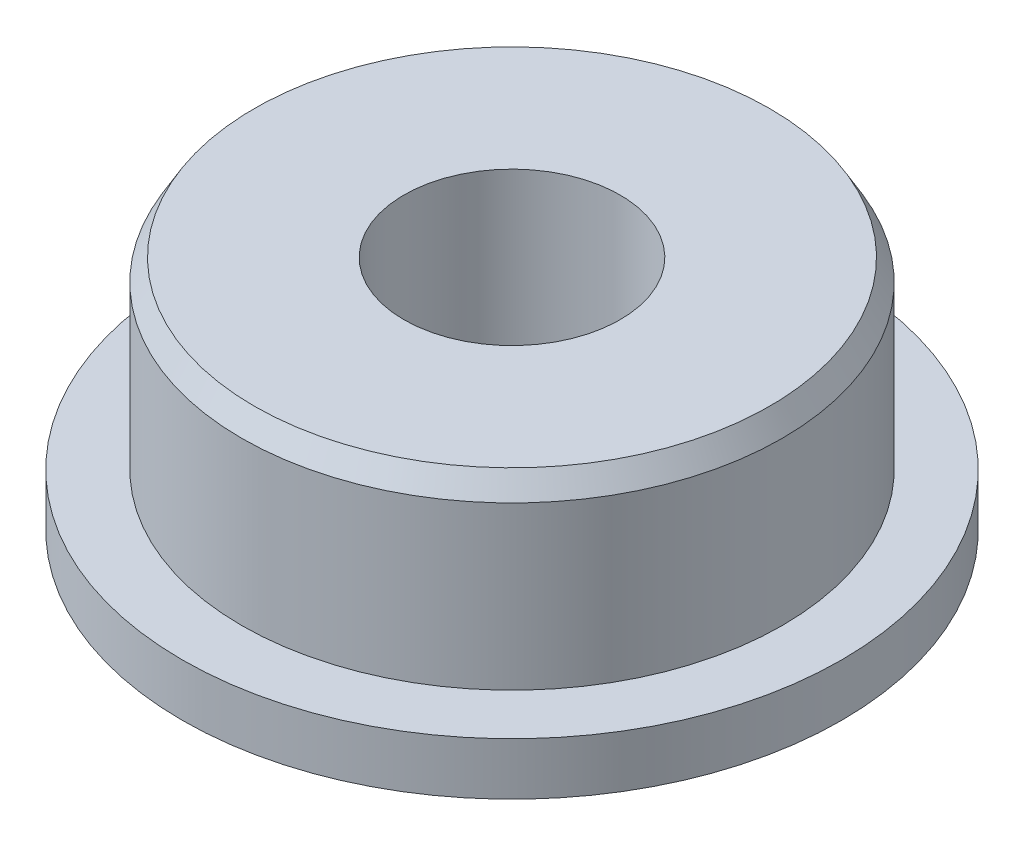
ISO-10303-21;
HEADER;
FILE_DESCRIPTION(('STEP AP214'),'2;1');
FILE_NAME('part.step','',(''),(''),'','','');
FILE_SCHEMA(('AUTOMOTIVE_DESIGN { 1 0 10303 214 1 1 1 1 }'));
ENDSEC;
DATA;
#1=APPLICATION_CONTEXT('core data for automotive mechanical design processes');
#2=APPLICATION_PROTOCOL_DEFINITION('international standard','automotive_design',2000,#1);
#3=PRODUCT_CONTEXT('',#1,'mechanical');
#4=PRODUCT('Part','Part','',(#3));
#5=PRODUCT_RELATED_PRODUCT_CATEGORY('part','',(#4));
#6=PRODUCT_DEFINITION_FORMATION('','',#4);
#7=PRODUCT_DEFINITION_CONTEXT('part definition',#1,'design');
#8=PRODUCT_DEFINITION('design','',#6,#7);
#9=PRODUCT_DEFINITION_SHAPE('','',#8);
#10=(LENGTH_UNIT() NAMED_UNIT(*) SI_UNIT(.MILLI.,.METRE.));
#11=(NAMED_UNIT(*) PLANE_ANGLE_UNIT() SI_UNIT($,.RADIAN.));
#12=(NAMED_UNIT(*) SI_UNIT($,.STERADIAN.) SOLID_ANGLE_UNIT());
#13=UNCERTAINTY_MEASURE_WITH_UNIT(LENGTH_MEASURE(1.E-05),#10,'distance_accuracy_value','');
#14=(GEOMETRIC_REPRESENTATION_CONTEXT(3) GLOBAL_UNCERTAINTY_ASSIGNED_CONTEXT((#13)) GLOBAL_UNIT_ASSIGNED_CONTEXT((#10,
#11,#12)) REPRESENTATION_CONTEXT('',''));
#15=CARTESIAN_POINT('',(0.,0.,0.));
#16=DIRECTION('',(0.,0.,1.));
#17=DIRECTION('',(1.,0.,0.));
#18=AXIS2_PLACEMENT_3D('',#15,#16,#17);
#19=CARTESIAN_POINT('',(0.,2.3,0.));
#20=DIRECTION('',(0.,-1.,0.));
#21=DIRECTION('',(0.,0.,-1.));
#22=AXIS2_PLACEMENT_3D('',#19,#20,#21);
#23=CYLINDRICAL_SURFACE('',#22,0.999999999999999);
#24=CARTESIAN_POINT('',(0.,2.3,0.));
#25=DIRECTION('',(0.,1.,0.));
#26=DIRECTION('',(0.,0.,1.));
#27=AXIS2_PLACEMENT_3D('',#24,#25,#26);
#28=CIRCLE('',#27,0.999999999999999);
#29=CARTESIAN_POINT('',(0.,2.3,0.999999999999999));
#30=VERTEX_POINT('',#29);
#31=EDGE_CURVE('E56',#30,#30,#28,.T.);
#32=ORIENTED_EDGE('',*,*,#31,.T.);
#33=EDGE_LOOP('',(#32));
#34=FACE_BOUND('',#33,.T.);
#35=CARTESIAN_POINT('',(0.,0.,0.));
#36=DIRECTION('',(0.,1.,0.));
#37=DIRECTION('',(0.,0.,1.));
#38=AXIS2_PLACEMENT_3D('',#35,#36,#37);
#39=CIRCLE('',#38,0.999999999999999);
#40=CARTESIAN_POINT('',(0.,0.,0.999999999999999));
#41=VERTEX_POINT('',#40);
#42=EDGE_CURVE('E57',#41,#41,#39,.T.);
#43=ORIENTED_EDGE('',*,*,#42,.F.);
#44=EDGE_LOOP('',(#43));
#45=FACE_BOUND('',#44,.T.);
#46=ADVANCED_FACE('F36',(#34,#45),#23,.F.);
#47=CARTESIAN_POINT('',(0.,2.3,0.));
#48=DIRECTION('',(0.,-1.,0.));
#49=DIRECTION('',(0.,0.,-1.));
#50=AXIS2_PLACEMENT_3D('',#47,#48,#49);
#51=CYLINDRICAL_SURFACE('',#50,2.5);
#52=CARTESIAN_POINT('',(0.,2.1,0.));
#53=DIRECTION('',(0.,1.,0.));
#54=DIRECTION('',(0.,0.,1.));
#55=AXIS2_PLACEMENT_3D('',#52,#53,#54);
#56=CIRCLE('',#55,2.5);
#57=CARTESIAN_POINT('',(0.,2.09999999999999,-2.5));
#58=VERTEX_POINT('',#57);
#59=EDGE_CURVE('E10',#58,#58,#56,.F.);
#60=ORIENTED_EDGE('',*,*,#59,.T.);
#61=EDGE_LOOP('',(#60));
#62=FACE_BOUND('',#61,.T.);
#63=CARTESIAN_POINT('',(0.,0.6,0.));
#64=DIRECTION('',(0.,1.,0.));
#65=DIRECTION('',(0.,0.,1.));
#66=AXIS2_PLACEMENT_3D('',#63,#64,#65);
#67=CIRCLE('',#66,2.5);
#68=CARTESIAN_POINT('',(0.,0.6,2.5));
#69=VERTEX_POINT('',#68);
#70=EDGE_CURVE('E65',#69,#69,#67,.T.);
#71=ORIENTED_EDGE('',*,*,#70,.T.);
#72=EDGE_LOOP('',(#71));
#73=FACE_BOUND('',#72,.T.);
#74=ADVANCED_FACE('F69',(#62,#73),#51,.T.);
#75=CARTESIAN_POINT('',(0.,2.3,0.));
#76=DIRECTION('',(0.,1.,0.));
#77=DIRECTION('',(0.,0.,1.));
#78=AXIS2_PLACEMENT_3D('',#75,#76,#77);
#79=PLANE('',#78);
#80=CARTESIAN_POINT('',(0.,2.3,0.));
#81=DIRECTION('',(0.,1.,0.));
#82=DIRECTION('',(0.,0.,1.));
#83=AXIS2_PLACEMENT_3D('',#80,#81,#82);
#84=CIRCLE('',#83,2.38452994616207);
#85=CARTESIAN_POINT('',(0.,2.3,-2.38452994616207));
#86=VERTEX_POINT('',#85);
#87=EDGE_CURVE('E43',#86,#86,#84,.T.);
#88=ORIENTED_EDGE('',*,*,#87,.T.);
#89=EDGE_LOOP('',(#88));
#90=FACE_BOUND('',#89,.T.);
#91=ORIENTED_EDGE('',*,*,#31,.F.);
#92=EDGE_LOOP('',(#91));
#93=FACE_BOUND('',#92,.T.);
#94=ADVANCED_FACE('F86',(#90,#93),#79,.T.);
#95=CARTESIAN_POINT('',(0.,0.,0.));
#96=DIRECTION('',(0.,1.,0.));
#97=DIRECTION('',(0.,0.,1.));
#98=AXIS2_PLACEMENT_3D('',#95,#96,#97);
#99=PLANE('',#98);
#100=CARTESIAN_POINT('',(0.,0.,0.));
#101=DIRECTION('',(0.,1.,0.));
#102=DIRECTION('',(0.,0.,1.));
#103=AXIS2_PLACEMENT_3D('',#100,#101,#102);
#104=CIRCLE('',#103,2.85);
#105=CARTESIAN_POINT('',(0.,0.,2.85));
#106=VERTEX_POINT('',#105);
#107=EDGE_CURVE('E47',#106,#106,#104,.F.);
#108=ORIENTED_EDGE('',*,*,#107,.T.);
#109=EDGE_LOOP('',(#108));
#110=FACE_BOUND('',#109,.T.);
#111=ORIENTED_EDGE('',*,*,#42,.T.);
#112=EDGE_LOOP('',(#111));
#113=FACE_BOUND('',#112,.T.);
#114=ADVANCED_FACE('F80',(#110,#113),#99,.F.);
#115=CARTESIAN_POINT('',(0.,0.6,0.));
#116=DIRECTION('',(0.,-1.,0.));
#117=DIRECTION('',(0.,0.,-1.));
#118=AXIS2_PLACEMENT_3D('',#115,#116,#117);
#119=CYLINDRICAL_SURFACE('',#118,3.05);
#120=CARTESIAN_POINT('',(0.,0.115470053837926,0.));
#121=DIRECTION('',(0.,1.,0.));
#122=DIRECTION('',(0.,0.,1.));
#123=AXIS2_PLACEMENT_3D('',#120,#121,#122);
#124=CIRCLE('',#123,3.05);
#125=CARTESIAN_POINT('',(0.,0.115470053837926,3.05));
#126=VERTEX_POINT('',#125);
#127=EDGE_CURVE('E51',#126,#126,#124,.T.);
#128=ORIENTED_EDGE('',*,*,#127,.T.);
#129=EDGE_LOOP('',(#128));
#130=FACE_BOUND('',#129,.T.);
#131=CARTESIAN_POINT('',(0.,0.6,0.));
#132=DIRECTION('',(0.,1.,0.));
#133=DIRECTION('',(0.,0.,1.));
#134=AXIS2_PLACEMENT_3D('',#131,#132,#133);
#135=CIRCLE('',#134,3.05);
#136=CARTESIAN_POINT('',(0.,0.6,3.05));
#137=VERTEX_POINT('',#136);
#138=EDGE_CURVE('E60',#137,#137,#135,.T.);
#139=ORIENTED_EDGE('',*,*,#138,.F.);
#140=EDGE_LOOP('',(#139));
#141=FACE_BOUND('',#140,.T.);
#142=ADVANCED_FACE('F75',(#130,#141),#119,.T.);
#143=CARTESIAN_POINT('',(0.,0.6,0.));
#144=DIRECTION('',(0.,1.,0.));
#145=DIRECTION('',(0.,0.,1.));
#146=AXIS2_PLACEMENT_3D('',#143,#144,#145);
#147=PLANE('',#146);
#148=ORIENTED_EDGE('',*,*,#70,.F.);
#149=EDGE_LOOP('',(#148));
#150=FACE_BOUND('',#149,.T.);
#151=ORIENTED_EDGE('',*,*,#138,.T.);
#152=EDGE_LOOP('',(#151));
#153=FACE_BOUND('',#152,.T.);
#154=ADVANCED_FACE('F71',(#150,#153),#147,.T.);
#155=CARTESIAN_POINT('',(0.,0.115470053837926,0.));
#156=DIRECTION('',(0.,1.,0.));
#157=DIRECTION('',(0.,0.,1.));
#158=AXIS2_PLACEMENT_3D('',#155,#156,#157);
#159=CONICAL_SURFACE('',#158,3.05,1.0471975511966);
#160=ORIENTED_EDGE('',*,*,#107,.F.);
#161=EDGE_LOOP('',(#160));
#162=FACE_BOUND('',#161,.T.);
#163=ORIENTED_EDGE('',*,*,#127,.F.);
#164=EDGE_LOOP('',(#163));
#165=FACE_BOUND('',#164,.T.);
#166=ADVANCED_FACE('F74',(#162,#165),#159,.T.);
#167=CARTESIAN_POINT('',(0.,2.3,0.));
#168=DIRECTION('',(0.,-1.,0.));
#169=DIRECTION('',(0.,0.,-1.));
#170=AXIS2_PLACEMENT_3D('',#167,#168,#169);
#171=CONICAL_SURFACE('',#170,2.38452994616207,0.523598775598299);
#172=CARTESIAN_POINT('',(0.,2.09999999999999,-2.5));
#173=CARTESIAN_POINT('',(0.,2.10208333333333,-2.49879718693919));
#174=CARTESIAN_POINT('',(0.,2.10416666666666,-2.49759437387838));
#175=CARTESIAN_POINT('',(0.,2.10833333333333,-2.49518874775675));
#176=CARTESIAN_POINT('',(0.,2.11041666666666,-2.49398593469594));
#177=CARTESIAN_POINT('',(0.,2.11458333333333,-2.49158030857432));
#178=CARTESIAN_POINT('',(0.,2.11666666666666,-2.49037749551351));
#179=CARTESIAN_POINT('',(0.,2.12083333333333,-2.48797186939188));
#180=CARTESIAN_POINT('',(0.,2.12291666666666,-2.48676905633107));
#181=CARTESIAN_POINT('',(0.,2.12708333333333,-2.48436343020945));
#182=CARTESIAN_POINT('',(0.,2.12916666666666,-2.48316061714864));
#183=CARTESIAN_POINT('',(0.,2.13333333333333,-2.48075499102701));
#184=CARTESIAN_POINT('',(0.,2.13541666666666,-2.4795521779662));
#185=CARTESIAN_POINT('',(0.,2.13958333333333,-2.47714655184458));
#186=CARTESIAN_POINT('',(0.,2.14166666666666,-2.47594373878377));
#187=CARTESIAN_POINT('',(0.,2.14583333333333,-2.47353811266214));
#188=CARTESIAN_POINT('',(0.,2.14791666666666,-2.47233529960133));
#189=CARTESIAN_POINT('',(0.,2.15208333333333,-2.46992967347971));
#190=CARTESIAN_POINT('',(0.,2.15416666666666,-2.46872686041889));
#191=CARTESIAN_POINT('',(0.,2.15833333333333,-2.46632123429727));
#192=CARTESIAN_POINT('',(0.,2.16041666666666,-2.46511842123646));
#193=CARTESIAN_POINT('',(0.,2.16458333333333,-2.46271279511484));
#194=CARTESIAN_POINT('',(0.,2.16666666666666,-2.46150998205402));
#195=CARTESIAN_POINT('',(0.,2.17083333333333,-2.4591043559324));
#196=CARTESIAN_POINT('',(0.,2.17291666666666,-2.45790154287159));
#197=CARTESIAN_POINT('',(0.,2.17708333333333,-2.45549591674997));
#198=CARTESIAN_POINT('',(0.,2.17916666666666,-2.45429310368915));
#199=CARTESIAN_POINT('',(0.,2.18333333333333,-2.45188747756753));
#200=CARTESIAN_POINT('',(0.,2.18541666666666,-2.45068466450672));
#201=CARTESIAN_POINT('',(0.,2.18958333333333,-2.44827903838509));
#202=CARTESIAN_POINT('',(0.,2.19166666666666,-2.44707622532428));
#203=CARTESIAN_POINT('',(0.,2.19583333333333,-2.44467059920266));
#204=CARTESIAN_POINT('',(0.,2.19791666666666,-2.44346778614185));
#205=CARTESIAN_POINT('',(0.,2.20208333333333,-2.44106216002022));
#206=CARTESIAN_POINT('',(0.,2.20416666666666,-2.43985934695941));
#207=CARTESIAN_POINT('',(0.,2.20833333333333,-2.43745372083779));
#208=CARTESIAN_POINT('',(0.,2.21041666666666,-2.43625090777698));
#209=CARTESIAN_POINT('',(0.,2.21458333333333,-2.43384528165535));
#210=CARTESIAN_POINT('',(0.,2.21666666666666,-2.43264246859454));
#211=CARTESIAN_POINT('',(0.,2.22083333333333,-2.43023684247292));
#212=CARTESIAN_POINT('',(0.,2.22291666666666,-2.42903402941211));
#213=CARTESIAN_POINT('',(0.,2.22708333333333,-2.42662840329048));
#214=CARTESIAN_POINT('',(0.,2.22916666666666,-2.42542559022967));
#215=CARTESIAN_POINT('',(0.,2.23333333333333,-2.42301996410805));
#216=CARTESIAN_POINT('',(0.,2.23541666666666,-2.42181715104724));
#217=CARTESIAN_POINT('',(0.,2.23958333333333,-2.41941152492561));
#218=CARTESIAN_POINT('',(0.,2.24166666666666,-2.4182087118648));
#219=CARTESIAN_POINT('',(0.,2.24583333333333,-2.41580308574318));
#220=CARTESIAN_POINT('',(0.,2.24791666666667,-2.41460027268237));
#221=CARTESIAN_POINT('',(0.,2.25208333333333,-2.41219464656074));
#222=CARTESIAN_POINT('',(0.,2.25416666666667,-2.41099183349993));
#223=CARTESIAN_POINT('',(0.,2.25833333333333,-2.40858620737831));
#224=CARTESIAN_POINT('',(0.,2.26041666666667,-2.4073833943175));
#225=CARTESIAN_POINT('',(0.,2.26458333333333,-2.40497776819587));
#226=CARTESIAN_POINT('',(0.,2.26666666666667,-2.40377495513506));
#227=CARTESIAN_POINT('',(0.,2.27083333333333,-2.40136932901344));
#228=CARTESIAN_POINT('',(0.,2.27291666666667,-2.40016651595263));
#229=CARTESIAN_POINT('',(0.,2.27708333333333,-2.397760889831));
#230=CARTESIAN_POINT('',(0.,2.27916666666667,-2.39655807677019));
#231=CARTESIAN_POINT('',(0.,2.28333333333333,-2.39415245064857));
#232=CARTESIAN_POINT('',(0.,2.28541666666667,-2.39294963758775));
#233=CARTESIAN_POINT('',(0.,2.28958333333333,-2.39054401146613));
#234=CARTESIAN_POINT('',(0.,2.29166666666667,-2.38934119840532));
#235=CARTESIAN_POINT('',(0.,2.29583333333333,-2.3869355722837));
#236=CARTESIAN_POINT('',(0.,2.29791666666667,-2.38573275922288));
#237=CARTESIAN_POINT('',(0.,2.3,-2.38452994616207));
#238=B_SPLINE_CURVE_WITH_KNOTS('',3,(#172,#173,#174,#175,#176,#177,#178,#179,#180,#181,#182,
#183,#184,#185,#186,#187,#188,#189,#190,#191,#192,#193,#194,#195,#196,#197,#198,#199,#200,#201,
#202,#203,#204,#205,#206,#207,#208,#209,#210,#211,#212,#213,#214,#215,#216,#217,#218,#219,#220,
#221,#222,#223,#224,#225,#226,#227,#228,#229,#230,#231,#232,#233,#234,#235,#236,#237),
.UNSPECIFIED.,.F.,.F.,(4,2,2,2,2,2,2,2,2,2,2,2,2,2,2,2,2,2,2,2,2,2,2,2,2,2,2,2,2,2,2,2,4),(0.,
0.0072168783648705,0.014433756729741,0.0216506350946115,0.028867513459482,0.0360843918243525,
0.043301270189223,0.0505181485540935,0.057735026918964,0.0649519052838347,0.0721687836487052,
0.0793856620135757,0.0866025403784462,0.0938194187433167,0.101036297108187,0.108253175473058,
0.115470053837928,0.122686932202798,0.129903810567669,0.137120688932539,0.14433756729741,
0.151554445662281,0.158771324027151,0.165988202392022,0.173205080756892,0.180421959121763,
0.187638837486633,0.194855715851503,0.202072594216374,0.209289472581245,0.216506350946115,
0.223723229310986,0.230940107675856),.UNSPECIFIED.);
#239=EDGE_CURVE('BSEAM38',#58,#86,#238,.T.);
#240=ORIENTED_EDGE('',*,*,#59,.F.);
#241=ORIENTED_EDGE('',*,*,#87,.F.);
#242=ORIENTED_EDGE('',*,*,#239,.T.);
#243=ORIENTED_EDGE('',*,*,#239,.F.);
#244=EDGE_LOOP('',(#240,#242,#241,#243));
#245=FACE_BOUND('',#244,.T.);
#246=ADVANCED_FACE('F38',(#245),#171,.T.);
#247=CLOSED_SHELL('',(#46,#74,#94,#114,#142,#154,#166,#246));
#248=MANIFOLD_SOLID_BREP('B2',#247);
#249=ADVANCED_BREP_SHAPE_REPRESENTATION('',(#18,#248),#14);
#250=SHAPE_DEFINITION_REPRESENTATION(#9,#249);
ENDSEC;
END-ISO-10303-21;
